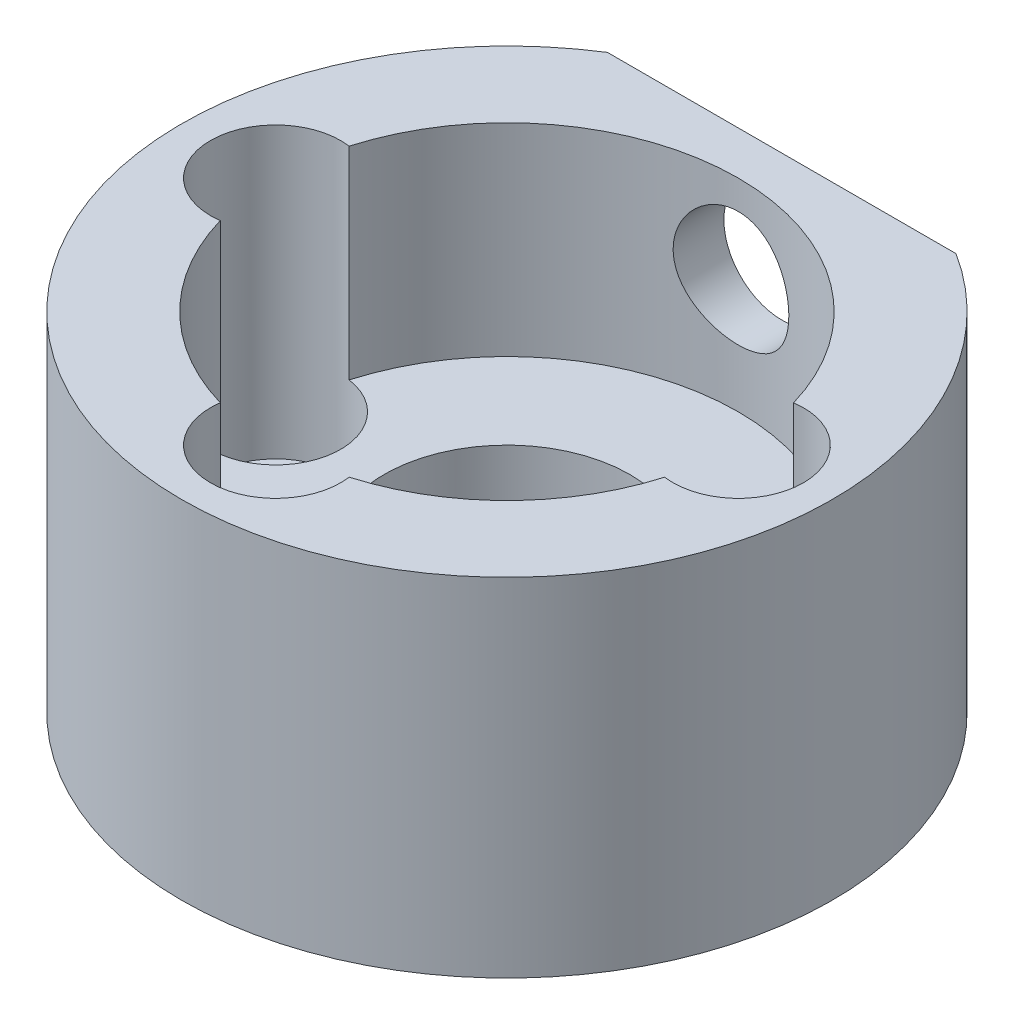
ISO-10303-21;
HEADER;
FILE_DESCRIPTION(('STEP AP214'),'2;1');
FILE_NAME('part.step','',(''),(''),'','','');
FILE_SCHEMA(('AUTOMOTIVE_DESIGN { 1 0 10303 214 1 1 1 1 }'));
ENDSEC;
DATA;
#1=APPLICATION_CONTEXT('core data for automotive mechanical design processes');
#2=APPLICATION_PROTOCOL_DEFINITION('international standard','automotive_design',2000,#1);
#3=PRODUCT_CONTEXT('',#1,'mechanical');
#4=PRODUCT('Part','Part','',(#3));
#5=PRODUCT_RELATED_PRODUCT_CATEGORY('part','',(#4));
#6=PRODUCT_DEFINITION_FORMATION('','',#4);
#7=PRODUCT_DEFINITION_CONTEXT('part definition',#1,'design');
#8=PRODUCT_DEFINITION('design','',#6,#7);
#9=PRODUCT_DEFINITION_SHAPE('','',#8);
#10=(LENGTH_UNIT() NAMED_UNIT(*) SI_UNIT(.MILLI.,.METRE.));
#11=(NAMED_UNIT(*) PLANE_ANGLE_UNIT() SI_UNIT($,.RADIAN.));
#12=(NAMED_UNIT(*) SI_UNIT($,.STERADIAN.) SOLID_ANGLE_UNIT());
#13=UNCERTAINTY_MEASURE_WITH_UNIT(LENGTH_MEASURE(1.E-05),#10,'distance_accuracy_value','');
#14=(GEOMETRIC_REPRESENTATION_CONTEXT(3) GLOBAL_UNCERTAINTY_ASSIGNED_CONTEXT((#13)) GLOBAL_UNIT_ASSIGNED_CONTEXT((#10,
#11,#12)) REPRESENTATION_CONTEXT('',''));
#15=CARTESIAN_POINT('',(0.,0.,0.));
#16=DIRECTION('',(0.,0.,1.));
#17=DIRECTION('',(1.,0.,0.));
#18=AXIS2_PLACEMENT_3D('',#15,#16,#17);
#19=CARTESIAN_POINT('',(0.,12.,0.));
#20=DIRECTION('',(0.,-1.,0.));
#21=DIRECTION('',(0.,0.,-1.));
#22=AXIS2_PLACEMENT_3D('',#19,#20,#21);
#23=CYLINDRICAL_SURFACE('',#22,11.25);
#24=CARTESIAN_POINT('',(0.,0.,0.));
#25=DIRECTION('',(0.,1.,0.));
#26=DIRECTION('',(0.,0.,1.));
#27=AXIS2_PLACEMENT_3D('',#24,#25,#26);
#28=CIRCLE('',#27,11.25);
#29=CARTESIAN_POINT('',(-6.02598539659698,0.,-9.5));
#30=VERTEX_POINT('',#29);
#31=CARTESIAN_POINT('',(6.02598539659698,0.,-9.5));
#32=VERTEX_POINT('',#31);
#33=EDGE_CURVE('E82',#30,#32,#28,.T.);
#34=ORIENTED_EDGE('',*,*,#33,.T.);
#35=DIRECTION('',(0.,-1.,0.));
#36=VECTOR('',#35,1.);
#37=CARTESIAN_POINT('',(6.02598539659698,12.,-9.5));
#38=LINE('',#37,#36);
#39=CARTESIAN_POINT('',(6.02598539659698,12.,-9.5));
#40=VERTEX_POINT('',#39);
#41=EDGE_CURVE('E77',#40,#32,#38,.T.);
#42=ORIENTED_EDGE('',*,*,#41,.F.);
#43=CARTESIAN_POINT('',(0.,12.,0.));
#44=DIRECTION('',(0.,1.,0.));
#45=DIRECTION('',(0.,0.,1.));
#46=AXIS2_PLACEMENT_3D('',#43,#44,#45);
#47=CIRCLE('',#46,11.25);
#48=CARTESIAN_POINT('',(-6.02598539659698,12.,-9.5));
#49=VERTEX_POINT('',#48);
#50=EDGE_CURVE('E81',#49,#40,#47,.T.);
#51=ORIENTED_EDGE('',*,*,#50,.F.);
#52=DIRECTION('',(0.,-1.,0.));
#53=VECTOR('',#52,1.);
#54=CARTESIAN_POINT('',(-6.02598539659698,12.,-9.5));
#55=LINE('',#54,#53);
#56=EDGE_CURVE('E74',#49,#30,#55,.T.);
#57=ORIENTED_EDGE('',*,*,#56,.T.);
#58=EDGE_LOOP('',(#34,#42,#51,#57));
#59=FACE_BOUND('',#58,.T.);
#60=ADVANCED_FACE('F35',(#59),#23,.T.);
#61=CARTESIAN_POINT('',(6.02598539659698,12.,-9.5));
#62=DIRECTION('',(0.,0.,1.));
#63=DIRECTION('',(1.,0.,0.));
#64=AXIS2_PLACEMENT_3D('',#61,#62,#63);
#65=PLANE('',#64);
#66=CARTESIAN_POINT('',(0.,9.00000000000001,-9.5));
#67=DIRECTION('',(0.,0.,-1.));
#68=DIRECTION('',(-1.,0.,0.));
#69=AXIS2_PLACEMENT_3D('',#66,#67,#68);
#70=CIRCLE('',#69,2.);
#71=CARTESIAN_POINT('',(-2.,9.00000000000001,-9.5));
#72=VERTEX_POINT('',#71);
#73=EDGE_CURVE('E107',#72,#72,#70,.T.);
#74=ORIENTED_EDGE('',*,*,#73,.F.);
#75=EDGE_LOOP('',(#74));
#76=FACE_BOUND('',#75,.T.);
#77=DIRECTION('',(-1.,0.,0.));
#78=VECTOR('',#77,1.);
#79=CARTESIAN_POINT('',(6.02598539659698,0.,-9.5));
#80=LINE('',#79,#78);
#81=EDGE_CURVE('E71',#32,#30,#80,.T.);
#82=ORIENTED_EDGE('',*,*,#81,.T.);
#83=ORIENTED_EDGE('',*,*,#56,.F.);
#84=DIRECTION('',(-1.,0.,0.));
#85=VECTOR('',#84,1.);
#86=CARTESIAN_POINT('',(6.02598539659698,12.,-9.5));
#87=LINE('',#86,#85);
#88=EDGE_CURVE('E59',#40,#49,#87,.T.);
#89=ORIENTED_EDGE('',*,*,#88,.F.);
#90=ORIENTED_EDGE('',*,*,#41,.T.);
#91=EDGE_LOOP('',(#82,#83,#89,#90));
#92=FACE_BOUND('',#91,.T.);
#93=ADVANCED_FACE('F73',(#76,#92),#65,.F.);
#94=CARTESIAN_POINT('',(0.,12.,0.));
#95=DIRECTION('',(0.,1.,0.));
#96=DIRECTION('',(0.,0.,1.));
#97=AXIS2_PLACEMENT_3D('',#94,#95,#96);
#98=PLANE('',#97);
#99=CARTESIAN_POINT('',(0.,12.,0.));
#100=DIRECTION('',(0.,1.,0.));
#101=DIRECTION('',(0.,0.,1.));
#102=AXIS2_PLACEMENT_3D('',#99,#100,#101);
#103=CIRCLE('',#102,8.);
#104=CARTESIAN_POINT('',(2.227641597062,12.,7.68359375));
#105=VERTEX_POINT('',#104);
#106=CARTESIAN_POINT('',(7.68359375,12.,2.227641597062));
#107=VERTEX_POINT('',#106);
#108=EDGE_CURVE('E212',#105,#107,#103,.T.);
#109=ORIENTED_EDGE('',*,*,#108,.F.);
#110=CARTESIAN_POINT('',(0.,12.,8.));
#111=DIRECTION('',(0.,1.,0.));
#112=DIRECTION('',(0.,0.,1.));
#113=AXIS2_PLACEMENT_3D('',#110,#111,#112);
#114=CIRCLE('',#113,2.25);
#115=CARTESIAN_POINT('',(-2.227641597062,12.,7.68359375));
#116=VERTEX_POINT('',#115);
#117=EDGE_CURVE('E241',#116,#105,#114,.T.);
#118=ORIENTED_EDGE('',*,*,#117,.F.);
#119=CARTESIAN_POINT('',(-7.68359375,12.,2.227641597062));
#120=VERTEX_POINT('',#119);
#121=EDGE_CURVE('E106',#120,#116,#103,.T.);
#122=ORIENTED_EDGE('',*,*,#121,.F.);
#123=CARTESIAN_POINT('',(-8.,12.,0.));
#124=DIRECTION('',(0.,1.,0.));
#125=DIRECTION('',(0.,0.,1.));
#126=AXIS2_PLACEMENT_3D('',#123,#124,#125);
#127=CIRCLE('',#126,2.25);
#128=CARTESIAN_POINT('',(-7.68359375,12.,-2.227641597062));
#129=VERTEX_POINT('',#128);
#130=EDGE_CURVE('E253',#129,#120,#127,.T.);
#131=ORIENTED_EDGE('',*,*,#130,.F.);
#132=CARTESIAN_POINT('',(7.68359375,12.,-2.227641597062));
#133=VERTEX_POINT('',#132);
#134=EDGE_CURVE('E218',#133,#129,#103,.T.);
#135=ORIENTED_EDGE('',*,*,#134,.F.);
#136=CARTESIAN_POINT('',(8.,12.,0.));
#137=DIRECTION('',(0.,1.,0.));
#138=DIRECTION('',(0.,0.,1.));
#139=AXIS2_PLACEMENT_3D('',#136,#137,#138);
#140=CIRCLE('',#139,2.25);
#141=EDGE_CURVE('E232',#107,#133,#140,.T.);
#142=ORIENTED_EDGE('',*,*,#141,.F.);
#143=EDGE_LOOP('',(#109,#118,#122,#131,#135,#142));
#144=FACE_BOUND('',#143,.T.);
#145=ORIENTED_EDGE('',*,*,#50,.T.);
#146=ORIENTED_EDGE('',*,*,#88,.T.);
#147=EDGE_LOOP('',(#145,#146));
#148=FACE_BOUND('',#147,.T.);
#149=ADVANCED_FACE('F134',(#144,#148),#98,.T.);
#150=CARTESIAN_POINT('',(0.,0.,0.));
#151=DIRECTION('',(0.,1.,0.));
#152=DIRECTION('',(0.,0.,1.));
#153=AXIS2_PLACEMENT_3D('',#150,#151,#152);
#154=PLANE('',#153);
#155=CARTESIAN_POINT('',(0.,0.,0.));
#156=DIRECTION('',(0.,-1.,0.));
#157=DIRECTION('',(0.,0.,-1.));
#158=AXIS2_PLACEMENT_3D('',#155,#156,#157);
#159=CIRCLE('',#158,4.25);
#160=CARTESIAN_POINT('',(0.,0.,-4.25));
#161=VERTEX_POINT('',#160);
#162=EDGE_CURVE('E323',#161,#161,#159,.T.);
#163=ORIENTED_EDGE('',*,*,#162,.F.);
#164=EDGE_LOOP('',(#163));
#165=FACE_BOUND('',#164,.T.);
#166=CARTESIAN_POINT('',(8.,0.,0.));
#167=DIRECTION('',(0.,1.,0.));
#168=DIRECTION('',(0.,0.,1.));
#169=AXIS2_PLACEMENT_3D('',#166,#167,#168);
#170=CIRCLE('',#169,1.25);
#171=CARTESIAN_POINT('',(8.,0.,1.25));
#172=VERTEX_POINT('',#171);
#173=EDGE_CURVE('E238',#172,#172,#170,.T.);
#174=ORIENTED_EDGE('',*,*,#173,.T.);
#175=EDGE_LOOP('',(#174));
#176=FACE_BOUND('',#175,.T.);
#177=CARTESIAN_POINT('',(0.,0.,8.));
#178=DIRECTION('',(0.,1.,0.));
#179=DIRECTION('',(0.,0.,1.));
#180=AXIS2_PLACEMENT_3D('',#177,#178,#179);
#181=CIRCLE('',#180,1.25);
#182=CARTESIAN_POINT('',(0.,0.,9.25));
#183=VERTEX_POINT('',#182);
#184=EDGE_CURVE('E250',#183,#183,#181,.T.);
#185=ORIENTED_EDGE('',*,*,#184,.T.);
#186=EDGE_LOOP('',(#185));
#187=FACE_BOUND('',#186,.T.);
#188=CARTESIAN_POINT('',(-8.,0.,0.));
#189=DIRECTION('',(0.,1.,0.));
#190=DIRECTION('',(0.,0.,1.));
#191=AXIS2_PLACEMENT_3D('',#188,#189,#190);
#192=CIRCLE('',#191,1.25);
#193=CARTESIAN_POINT('',(-8.,0.,1.25));
#194=VERTEX_POINT('',#193);
#195=EDGE_CURVE('E87',#194,#194,#192,.T.);
#196=ORIENTED_EDGE('',*,*,#195,.T.);
#197=EDGE_LOOP('',(#196));
#198=FACE_BOUND('',#197,.T.);
#199=ORIENTED_EDGE('',*,*,#33,.F.);
#200=ORIENTED_EDGE('',*,*,#81,.F.);
#201=EDGE_LOOP('',(#199,#200));
#202=FACE_BOUND('',#201,.T.);
#203=ADVANCED_FACE('F86',(#165,#176,#187,#198,#202),#154,.F.);
#204=CARTESIAN_POINT('',(-8.,12.,0.));
#205=DIRECTION('',(0.,1.,0.));
#206=DIRECTION('',(0.,0.,1.));
#207=AXIS2_PLACEMENT_3D('',#204,#205,#206);
#208=CYLINDRICAL_SURFACE('',#207,1.25);
#209=ORIENTED_EDGE('',*,*,#195,.F.);
#210=EDGE_LOOP('',(#209));
#211=FACE_BOUND('',#210,.T.);
#212=CARTESIAN_POINT('',(-8.,2.,0.));
#213=DIRECTION('',(0.,1.,0.));
#214=DIRECTION('',(0.,0.,1.));
#215=AXIS2_PLACEMENT_3D('',#212,#213,#214);
#216=CIRCLE('',#215,1.25);
#217=CARTESIAN_POINT('',(-8.,2.,1.25));
#218=VERTEX_POINT('',#217);
#219=EDGE_CURVE('E90',#218,#218,#216,.T.);
#220=ORIENTED_EDGE('',*,*,#219,.T.);
#221=EDGE_LOOP('',(#220));
#222=FACE_BOUND('',#221,.T.);
#223=ADVANCED_FACE('F143',(#211,#222),#208,.F.);
#224=CARTESIAN_POINT('',(-6.75,2.,0.));
#225=DIRECTION('',(0.,-1.,0.));
#226=DIRECTION('',(0.,0.,-1.));
#227=AXIS2_PLACEMENT_3D('',#224,#225,#226);
#228=PLANE('',#227);
#229=ORIENTED_EDGE('',*,*,#219,.F.);
#230=EDGE_LOOP('',(#229));
#231=FACE_BOUND('',#230,.T.);
#232=CARTESIAN_POINT('',(-8.,2.,0.));
#233=DIRECTION('',(0.,1.,0.));
#234=DIRECTION('',(0.,0.,1.));
#235=AXIS2_PLACEMENT_3D('',#232,#233,#234);
#236=CIRCLE('',#235,2.25);
#237=CARTESIAN_POINT('',(-8.,2.,2.25));
#238=VERTEX_POINT('',#237);
#239=EDGE_CURVE('E256',#238,#238,#236,.T.);
#240=ORIENTED_EDGE('',*,*,#239,.T.);
#241=EDGE_LOOP('',(#240));
#242=FACE_BOUND('',#241,.T.);
#243=ADVANCED_FACE('F148',(#231,#242),#228,.F.);
#244=CARTESIAN_POINT('',(-8.,12.,0.));
#245=DIRECTION('',(0.,1.,0.));
#246=DIRECTION('',(0.,0.,1.));
#247=AXIS2_PLACEMENT_3D('',#244,#245,#246);
#248=CYLINDRICAL_SURFACE('',#247,2.25);
#249=ORIENTED_EDGE('',*,*,#239,.F.);
#250=EDGE_LOOP('',(#249));
#251=FACE_BOUND('',#250,.T.);
#252=CARTESIAN_POINT('',(-8.,5.,0.));
#253=DIRECTION('',(0.,1.,0.));
#254=DIRECTION('',(0.,0.,1.));
#255=AXIS2_PLACEMENT_3D('',#252,#253,#254);
#256=CIRCLE('',#255,2.25);
#257=CARTESIAN_POINT('',(-7.68359375,5.,-2.227641597062));
#258=VERTEX_POINT('',#257);
#259=CARTESIAN_POINT('',(-7.68359375,5.,2.227641597062));
#260=VERTEX_POINT('',#259);
#261=EDGE_CURVE('E220',#258,#260,#256,.F.);
#262=ORIENTED_EDGE('',*,*,#261,.F.);
#263=DIRECTION('',(0.,1.,0.));
#264=VECTOR('',#263,1.);
#265=CARTESIAN_POINT('',(-7.68359375,8.5,-2.227641597062));
#266=LINE('',#265,#264);
#267=EDGE_CURVE('E207',#258,#129,#266,.T.);
#268=ORIENTED_EDGE('',*,*,#267,.T.);
#269=ORIENTED_EDGE('',*,*,#130,.T.);
#270=DIRECTION('',(0.,1.,0.));
#271=VECTOR('',#270,1.);
#272=CARTESIAN_POINT('',(-7.68359375,8.5,2.227641597062));
#273=LINE('',#272,#271);
#274=EDGE_CURVE('E228',#120,#260,#273,.F.);
#275=ORIENTED_EDGE('',*,*,#274,.T.);
#276=EDGE_LOOP('',(#262,#268,#269,#275));
#277=FACE_BOUND('',#276,.T.);
#278=ADVANCED_FACE('F152',(#251,#277),#248,.F.);
#279=CARTESIAN_POINT('',(0.,12.,8.));
#280=DIRECTION('',(0.,1.,0.));
#281=DIRECTION('',(0.,0.,1.));
#282=AXIS2_PLACEMENT_3D('',#279,#280,#281);
#283=CYLINDRICAL_SURFACE('',#282,1.25);
#284=ORIENTED_EDGE('',*,*,#184,.F.);
#285=EDGE_LOOP('',(#284));
#286=FACE_BOUND('',#285,.T.);
#287=CARTESIAN_POINT('',(0.,2.,8.));
#288=DIRECTION('',(0.,1.,0.));
#289=DIRECTION('',(0.,0.,1.));
#290=AXIS2_PLACEMENT_3D('',#287,#288,#289);
#291=CIRCLE('',#290,1.25);
#292=CARTESIAN_POINT('',(0.,2.,9.25));
#293=VERTEX_POINT('',#292);
#294=EDGE_CURVE('E247',#293,#293,#291,.T.);
#295=ORIENTED_EDGE('',*,*,#294,.T.);
#296=EDGE_LOOP('',(#295));
#297=FACE_BOUND('',#296,.T.);
#298=ADVANCED_FACE('F156',(#286,#297),#283,.F.);
#299=CARTESIAN_POINT('',(1.25,2.,8.));
#300=DIRECTION('',(0.,-1.,0.));
#301=DIRECTION('',(0.,0.,-1.));
#302=AXIS2_PLACEMENT_3D('',#299,#300,#301);
#303=PLANE('',#302);
#304=ORIENTED_EDGE('',*,*,#294,.F.);
#305=EDGE_LOOP('',(#304));
#306=FACE_BOUND('',#305,.T.);
#307=CARTESIAN_POINT('',(0.,2.,8.));
#308=DIRECTION('',(0.,1.,0.));
#309=DIRECTION('',(0.,0.,1.));
#310=AXIS2_PLACEMENT_3D('',#307,#308,#309);
#311=CIRCLE('',#310,2.25);
#312=CARTESIAN_POINT('',(0.,2.,10.25));
#313=VERTEX_POINT('',#312);
#314=EDGE_CURVE('E244',#313,#313,#311,.T.);
#315=ORIENTED_EDGE('',*,*,#314,.T.);
#316=EDGE_LOOP('',(#315));
#317=FACE_BOUND('',#316,.T.);
#318=ADVANCED_FACE('F160',(#306,#317),#303,.F.);
#319=CARTESIAN_POINT('',(0.,12.,8.));
#320=DIRECTION('',(0.,1.,0.));
#321=DIRECTION('',(0.,0.,1.));
#322=AXIS2_PLACEMENT_3D('',#319,#320,#321);
#323=CYLINDRICAL_SURFACE('',#322,2.25);
#324=ORIENTED_EDGE('',*,*,#314,.F.);
#325=EDGE_LOOP('',(#324));
#326=FACE_BOUND('',#325,.T.);
#327=CARTESIAN_POINT('',(0.,5.,8.));
#328=DIRECTION('',(0.,1.,0.));
#329=DIRECTION('',(0.,0.,1.));
#330=AXIS2_PLACEMENT_3D('',#327,#328,#329);
#331=CIRCLE('',#330,2.25);
#332=CARTESIAN_POINT('',(-2.227641597062,5.,7.68359375));
#333=VERTEX_POINT('',#332);
#334=CARTESIAN_POINT('',(2.227641597062,5.,7.68359375));
#335=VERTEX_POINT('',#334);
#336=EDGE_CURVE('E210',#333,#335,#331,.F.);
#337=ORIENTED_EDGE('',*,*,#336,.F.);
#338=DIRECTION('',(0.,1.,0.));
#339=VECTOR('',#338,1.);
#340=CARTESIAN_POINT('',(-2.227641597062,8.5,7.68359375));
#341=LINE('',#340,#339);
#342=EDGE_CURVE('E225',#333,#116,#341,.T.);
#343=ORIENTED_EDGE('',*,*,#342,.T.);
#344=ORIENTED_EDGE('',*,*,#117,.T.);
#345=DIRECTION('',(0.,1.,0.));
#346=VECTOR('',#345,1.);
#347=CARTESIAN_POINT('',(2.227641597062,8.5,7.68359375));
#348=LINE('',#347,#346);
#349=EDGE_CURVE('E222',#105,#335,#348,.F.);
#350=ORIENTED_EDGE('',*,*,#349,.T.);
#351=EDGE_LOOP('',(#337,#343,#344,#350));
#352=FACE_BOUND('',#351,.T.);
#353=ADVANCED_FACE('F164',(#326,#352),#323,.F.);
#354=CARTESIAN_POINT('',(8.,12.,0.));
#355=DIRECTION('',(0.,1.,0.));
#356=DIRECTION('',(0.,0.,1.));
#357=AXIS2_PLACEMENT_3D('',#354,#355,#356);
#358=CYLINDRICAL_SURFACE('',#357,1.25);
#359=ORIENTED_EDGE('',*,*,#173,.F.);
#360=EDGE_LOOP('',(#359));
#361=FACE_BOUND('',#360,.T.);
#362=CARTESIAN_POINT('',(8.,2.,0.));
#363=DIRECTION('',(0.,1.,0.));
#364=DIRECTION('',(0.,0.,1.));
#365=AXIS2_PLACEMENT_3D('',#362,#363,#364);
#366=CIRCLE('',#365,1.25);
#367=CARTESIAN_POINT('',(8.,2.,1.25));
#368=VERTEX_POINT('',#367);
#369=EDGE_CURVE('E235',#368,#368,#366,.T.);
#370=ORIENTED_EDGE('',*,*,#369,.T.);
#371=EDGE_LOOP('',(#370));
#372=FACE_BOUND('',#371,.T.);
#373=ADVANCED_FACE('F168',(#361,#372),#358,.F.);
#374=CARTESIAN_POINT('',(9.25,2.,0.));
#375=DIRECTION('',(0.,-1.,0.));
#376=DIRECTION('',(0.,0.,-1.));
#377=AXIS2_PLACEMENT_3D('',#374,#375,#376);
#378=PLANE('',#377);
#379=ORIENTED_EDGE('',*,*,#369,.F.);
#380=EDGE_LOOP('',(#379));
#381=FACE_BOUND('',#380,.T.);
#382=CARTESIAN_POINT('',(8.,2.,0.));
#383=DIRECTION('',(0.,1.,0.));
#384=DIRECTION('',(0.,0.,1.));
#385=AXIS2_PLACEMENT_3D('',#382,#383,#384);
#386=CIRCLE('',#385,2.25);
#387=CARTESIAN_POINT('',(8.,2.,2.25));
#388=VERTEX_POINT('',#387);
#389=EDGE_CURVE('E186',#388,#388,#386,.T.);
#390=ORIENTED_EDGE('',*,*,#389,.T.);
#391=EDGE_LOOP('',(#390));
#392=FACE_BOUND('',#391,.T.);
#393=ADVANCED_FACE('F172',(#381,#392),#378,.F.);
#394=CARTESIAN_POINT('',(8.,12.,0.));
#395=DIRECTION('',(0.,1.,0.));
#396=DIRECTION('',(0.,0.,1.));
#397=AXIS2_PLACEMENT_3D('',#394,#395,#396);
#398=CYLINDRICAL_SURFACE('',#397,2.25);
#399=ORIENTED_EDGE('',*,*,#389,.F.);
#400=EDGE_LOOP('',(#399));
#401=FACE_BOUND('',#400,.T.);
#402=CARTESIAN_POINT('',(8.,5.,0.));
#403=DIRECTION('',(0.,1.,0.));
#404=DIRECTION('',(0.,0.,1.));
#405=AXIS2_PLACEMENT_3D('',#402,#403,#404);
#406=CIRCLE('',#405,2.25);
#407=CARTESIAN_POINT('',(7.68359375,5.,2.227641597062));
#408=VERTEX_POINT('',#407);
#409=CARTESIAN_POINT('',(7.68359375,5.,-2.227641597062));
#410=VERTEX_POINT('',#409);
#411=EDGE_CURVE('E96',#408,#410,#406,.F.);
#412=ORIENTED_EDGE('',*,*,#411,.F.);
#413=DIRECTION('',(0.,1.,0.));
#414=VECTOR('',#413,1.);
#415=CARTESIAN_POINT('',(7.68359375,8.5,2.227641597062));
#416=LINE('',#415,#414);
#417=EDGE_CURVE('E11',#408,#107,#416,.T.);
#418=ORIENTED_EDGE('',*,*,#417,.T.);
#419=ORIENTED_EDGE('',*,*,#141,.T.);
#420=DIRECTION('',(0.,1.,0.));
#421=VECTOR('',#420,1.);
#422=CARTESIAN_POINT('',(7.68359375,8.5,-2.227641597062));
#423=LINE('',#422,#421);
#424=EDGE_CURVE('E43',#133,#410,#423,.F.);
#425=ORIENTED_EDGE('',*,*,#424,.T.);
#426=EDGE_LOOP('',(#412,#418,#419,#425));
#427=FACE_BOUND('',#426,.T.);
#428=ADVANCED_FACE('F175',(#401,#427),#398,.F.);
#429=CARTESIAN_POINT('',(0.,5.,0.));
#430=DIRECTION('',(0.,1.,0.));
#431=DIRECTION('',(0.,0.,1.));
#432=AXIS2_PLACEMENT_3D('',#429,#430,#431);
#433=CYLINDRICAL_SURFACE('',#432,8.);
#434=CARTESIAN_POINT('',(-2.,9.00000000000001,-7.74596669241483));
#435=CARTESIAN_POINT('',(-1.99999686287446,9.11044060074127,-7.74596880070288));
#436=CARTESIAN_POINT('',(-1.99082099639812,9.22091591894282,-7.74835444811678));
#437=CARTESIAN_POINT('',(-1.95441850037103,9.43869406253881,-7.75761489594051));
#438=CARTESIAN_POINT('',(-1.92718136539368,9.54599500357455,-7.76449230897304));
#439=CARTESIAN_POINT('',(-1.85559295970563,9.75424283054975,-7.7819097967692));
#440=CARTESIAN_POINT('',(-1.81126378228359,9.85519772430857,-7.79244514152366));
#441=CARTESIAN_POINT('',(-1.70681691300911,10.0482486820319,-7.81598553623007));
#442=CARTESIAN_POINT('',(-1.64669855084855,10.1403443696642,-7.82899069102791));
#443=CARTESIAN_POINT('',(-1.5109667418495,10.3150893162098,-7.856325730845));
#444=CARTESIAN_POINT('',(-1.43506951016324,10.39751488028,-7.87067678098427));
#445=CARTESIAN_POINT('',(-1.27054565128053,10.5486091154883,-7.89890300412235));
#446=CARTESIAN_POINT('',(-1.18191783534425,10.6172765004974,-7.91277813253111));
#447=CARTESIAN_POINT('',(-0.992916160863164,10.739820374105,-7.93872332416466));
#448=CARTESIAN_POINT('',(-0.892395660956097,10.7934771105292,-7.95076549920474));
#449=CARTESIAN_POINT('',(-0.68341054743421,10.8830477153225,-7.97144649540787));
#450=CARTESIAN_POINT('',(-0.574947108633552,10.9189642015324,-7.98008581867475));
#451=CARTESIAN_POINT('',(-0.355487007003329,10.9713182676629,-7.99283807078544));
#452=CARTESIAN_POINT('',(-0.24458617563918,10.9881357154613,-7.99703915075451));
#453=CARTESIAN_POINT('',(-0.0214630554102151,11.0030067034204,-8.00074875285838));
#454=CARTESIAN_POINT('',(0.0907590356304552,11.0010630177677,-8.00025796877363));
#455=CARTESIAN_POINT('',(0.310704494344775,10.9787401197999,-7.99470475962828));
#456=CARTESIAN_POINT('',(0.418472431202134,10.9587709399569,-7.98974401872699));
#457=CARTESIAN_POINT('',(0.629076494827373,10.9016229839612,-7.97592669219883));
#458=CARTESIAN_POINT('',(0.731912358740876,10.8644432916981,-7.96706989918753));
#459=CARTESIAN_POINT('',(0.930813407003613,10.7735979434504,-7.94630007760717));
#460=CARTESIAN_POINT('',(1.02680901953301,10.7197863642706,-7.93436015756043));
#461=CARTESIAN_POINT('',(1.20855124468098,10.597315456707,-7.90871923047719));
#462=CARTESIAN_POINT('',(1.29429607017101,10.5286535451515,-7.89501791721992));
#463=CARTESIAN_POINT('',(1.45554807016991,10.3762330064141,-7.86690971015616));
#464=CARTESIAN_POINT('',(1.5307153581504,10.2921160861218,-7.85249375620734));
#465=CARTESIAN_POINT('',(1.66595275192604,10.1123200211678,-7.82492034813365));
#466=CARTESIAN_POINT('',(1.72602215209203,10.0166403364072,-7.81176295284776));
#467=CARTESIAN_POINT('',(1.8295762580452,9.81576797268083,-7.78816397465319));
#468=CARTESIAN_POINT('',(1.87297913394098,9.71053141574945,-7.77773586980577));
#469=CARTESIAN_POINT('',(1.94137124127268,9.49393162553884,-7.76094912111966));
#470=CARTESIAN_POINT('',(1.96636441310582,9.3825697088135,-7.75458960648175));
#471=CARTESIAN_POINT('',(1.99666371093214,9.16003239878151,-7.74684284831312));
#472=CARTESIAN_POINT('',(2.0024723791357,9.0489297653363,-7.74532871274918));
#473=CARTESIAN_POINT('',(1.99561359241244,8.82734245073748,-7.74709874784831));
#474=CARTESIAN_POINT('',(1.98294783827904,8.71685771363901,-7.75038247681013));
#475=CARTESIAN_POINT('',(1.93994037115013,8.50150858803624,-7.76125665563648));
#476=CARTESIAN_POINT('',(1.9098912546254,8.39658181874333,-7.768775761875));
#477=CARTESIAN_POINT('',(1.8332944653365,8.19325483371866,-7.7872057461677));
#478=CARTESIAN_POINT('',(1.78674483817004,8.09485539275573,-7.79811702598891));
#479=CARTESIAN_POINT('',(1.67741653434925,7.90524697770613,-7.8223690967461));
#480=CARTESIAN_POINT('',(1.6143374030685,7.81421692796552,-7.83575334885313));
#481=CARTESIAN_POINT('',(1.47412058586891,7.64384930975892,-7.86333666457373));
#482=CARTESIAN_POINT('',(1.39698058961088,7.56451366667995,-7.87753586182776));
#483=CARTESIAN_POINT('',(1.22852544196945,7.41775116594324,-7.90557922425285));
#484=CARTESIAN_POINT('',(1.13690390506319,7.35067194996096,-7.91940561649468));
#485=CARTESIAN_POINT('',(0.943405365389353,7.23285130643901,-7.94477773290987));
#486=CARTESIAN_POINT('',(0.841528897915183,7.18210902671344,-7.95632357603169));
#487=CARTESIAN_POINT('',(0.631116403462182,7.09884317237766,-7.9757609259065));
#488=CARTESIAN_POINT('',(0.522634762055765,7.06618857249675,-7.98367864017925));
#489=CARTESIAN_POINT('',(0.301499520637615,7.01963173231327,-7.99508234716634));
#490=CARTESIAN_POINT('',(0.188846730082482,7.00572587300877,-7.99856919514738));
#491=CARTESIAN_POINT('',(-0.0341670528866446,6.99726482084893,-8.00068338817612));
#492=CARTESIAN_POINT('',(-0.144507653932041,7.00219658180919,-7.99943957759977));
#493=CARTESIAN_POINT('',(-0.3627349928295,7.0300956545887,-7.99251792914887));
#494=CARTESIAN_POINT('',(-0.470621803561855,7.05306243002634,-7.98684022314338));
#495=CARTESIAN_POINT('',(-0.680342071289547,7.11610443954173,-7.97170865707778));
#496=CARTESIAN_POINT('',(-0.782204989161725,7.15608690662876,-7.96227529004785));
#497=CARTESIAN_POINT('',(-0.977834106083248,7.25194115803915,-7.94062577827316));
#498=CARTESIAN_POINT('',(-1.07159928253127,7.30781494534097,-7.92840928277515));
#499=CARTESIAN_POINT('',(-1.25080385684661,7.43543046799227,-7.90214499360574));
#500=CARTESIAN_POINT('',(-1.33598997659667,7.50752028580766,-7.88806033883329));
#501=CARTESIAN_POINT('',(-1.49323004054701,7.6648457039547,-7.85981298114379));
#502=CARTESIAN_POINT('',(-1.56528065015318,7.75008463222233,-7.84565025934604));
#503=CARTESIAN_POINT('',(-1.69552405294366,7.93320282837893,-7.81854951691005));
#504=CARTESIAN_POINT('',(-1.75343323883276,8.03128824673051,-7.80563927346578));
#505=CARTESIAN_POINT('',(-1.85185379317094,8.23611097974964,-7.78287910989656));
#506=CARTESIAN_POINT('',(-1.8923778195043,8.3428419321877,-7.77302696466427));
#507=CARTESIAN_POINT('',(-1.948845057142,8.54115402367032,-7.75903817501475));
#508=CARTESIAN_POINT('',(-1.96798634119376,8.63178632877228,-7.75417326006998));
#509=CARTESIAN_POINT('',(-1.99356458514354,8.81493773799538,-7.7476367716524));
#510=CARTESIAN_POINT('',(-2.0000026287435,8.90745668048881,-7.74596492578215));
#511=CARTESIAN_POINT('',(-2.,9.00000000000001,-7.74596669241483));
#512=B_SPLINE_CURVE_WITH_KNOTS('',3,(#434,#435,#436,#437,#438,#439,#440,#441,#442,#443,#444,
#445,#446,#447,#448,#449,#450,#451,#452,#453,#454,#455,#456,#457,#458,#459,#460,#461,#462,#463,
#464,#465,#466,#467,#468,#469,#470,#471,#472,#473,#474,#475,#476,#477,#478,#479,#480,#481,#482,
#483,#484,#485,#486,#487,#488,#489,#490,#491,#492,#493,#494,#495,#496,#497,#498,#499,#500,#501,
#502,#503,#504,#505,#506,#507,#508,#509,#510,#511),.UNSPECIFIED.,.T.,.F.,(4,2,2,2,2,2,2,2,2,2,2,
2,2,2,2,2,2,2,2,2,2,2,2,2,2,2,2,2,2,2,2,2,2,2,2,2,2,2,4),(0.,0.33098195338891,0.662156593142932,
0.992904581732815,1.32366661404383,1.66099163354381,1.99834817183893,2.34041197118336,
2.68242527877674,3.01751000796277,3.35254518932816,3.68014610151158,4.00776445379829,
4.33834299403556,4.66897908375131,5.00856373257529,5.34816424959842,5.68941145606722,
6.03058560103638,6.36274859809374,6.69488101747042,7.02157924007366,7.34831617137134,
7.68146276687326,8.01466415108036,8.35620264772255,8.69772332575643,9.03673658245544,
9.37568439127231,9.70546756901965,10.0352409390158,10.3632390124777,10.6912784459046,
11.0271767726566,11.3631602525241,11.7054118182895,12.0474137709606,12.3247826174462,
12.6021278008238),.UNSPECIFIED.);
#513=CARTESIAN_POINT('',(-2.,9.00000000000001,-7.74596669241483));
#514=VERTEX_POINT('',#513);
#515=EDGE_CURVE('E99',#514,#514,#512,.T.);
#516=ORIENTED_EDGE('',*,*,#515,.T.);
#517=EDGE_LOOP('',(#516));
#518=FACE_BOUND('',#517,.T.);
#519=CARTESIAN_POINT('',(0.,5.,0.));
#520=DIRECTION('',(0.,1.,0.));
#521=DIRECTION('',(0.,0.,1.));
#522=AXIS2_PLACEMENT_3D('',#519,#520,#521);
#523=CIRCLE('',#522,8.);
#524=EDGE_CURVE('E197',#410,#258,#523,.T.);
#525=ORIENTED_EDGE('',*,*,#524,.F.);
#526=ORIENTED_EDGE('',*,*,#424,.F.);
#527=ORIENTED_EDGE('',*,*,#134,.T.);
#528=ORIENTED_EDGE('',*,*,#267,.F.);
#529=EDGE_LOOP('',(#525,#526,#527,#528));
#530=FACE_BOUND('',#529,.T.);
#531=ADVANCED_FACE('F108',(#518,#530),#433,.F.);
#532=ORIENTED_EDGE('',*,*,#121,.T.);
#533=ORIENTED_EDGE('',*,*,#342,.F.);
#534=EDGE_CURVE('E208',#260,#333,#523,.T.);
#535=ORIENTED_EDGE('',*,*,#534,.F.);
#536=ORIENTED_EDGE('',*,*,#274,.F.);
#537=EDGE_LOOP('',(#532,#533,#535,#536));
#538=FACE_BOUND('',#537,.T.);
#539=ADVANCED_FACE('F127',(#538),#433,.F.);
#540=ORIENTED_EDGE('',*,*,#108,.T.);
#541=ORIENTED_EDGE('',*,*,#417,.F.);
#542=EDGE_CURVE('E51',#335,#408,#523,.T.);
#543=ORIENTED_EDGE('',*,*,#542,.F.);
#544=ORIENTED_EDGE('',*,*,#349,.F.);
#545=EDGE_LOOP('',(#540,#541,#543,#544));
#546=FACE_BOUND('',#545,.T.);
#547=ADVANCED_FACE('F120',(#546),#433,.F.);
#548=CARTESIAN_POINT('',(0.,5.,0.));
#549=DIRECTION('',(0.,1.,0.));
#550=DIRECTION('',(0.,0.,1.));
#551=AXIS2_PLACEMENT_3D('',#548,#549,#550);
#552=PLANE('',#551);
#553=CARTESIAN_POINT('',(0.,5.,0.));
#554=DIRECTION('',(0.,1.,0.));
#555=DIRECTION('',(0.,0.,1.));
#556=AXIS2_PLACEMENT_3D('',#553,#554,#555);
#557=CIRCLE('',#556,4.25);
#558=CARTESIAN_POINT('',(0.,5.,4.25));
#559=VERTEX_POINT('',#558);
#560=EDGE_CURVE('E38',#559,#559,#557,.T.);
#561=ORIENTED_EDGE('',*,*,#560,.F.);
#562=EDGE_LOOP('',(#561));
#563=FACE_BOUND('',#562,.T.);
#564=ORIENTED_EDGE('',*,*,#261,.T.);
#565=ORIENTED_EDGE('',*,*,#534,.T.);
#566=ORIENTED_EDGE('',*,*,#336,.T.);
#567=ORIENTED_EDGE('',*,*,#542,.T.);
#568=ORIENTED_EDGE('',*,*,#411,.T.);
#569=ORIENTED_EDGE('',*,*,#524,.T.);
#570=EDGE_LOOP('',(#564,#565,#566,#567,#568,#569));
#571=FACE_BOUND('',#570,.T.);
#572=ADVANCED_FACE('F117',(#563,#571),#552,.T.);
#573=CARTESIAN_POINT('',(0.,9.00000000000001,0.5));
#574=DIRECTION('',(0.,0.,-1.));
#575=DIRECTION('',(-1.,0.,0.));
#576=AXIS2_PLACEMENT_3D('',#573,#574,#575);
#577=CYLINDRICAL_SURFACE('',#576,2.);
#578=ORIENTED_EDGE('',*,*,#73,.T.);
#579=EDGE_LOOP('',(#578));
#580=FACE_BOUND('',#579,.T.);
#581=ORIENTED_EDGE('',*,*,#515,.F.);
#582=EDGE_LOOP('',(#581));
#583=FACE_BOUND('',#582,.T.);
#584=ADVANCED_FACE('F112',(#580,#583),#577,.F.);
#585=CARTESIAN_POINT('',(0.,12.,0.));
#586=DIRECTION('',(0.,-1.,0.));
#587=DIRECTION('',(0.,0.,-1.));
#588=AXIS2_PLACEMENT_3D('',#585,#586,#587);
#589=CYLINDRICAL_SURFACE('',#588,4.25);
#590=ORIENTED_EDGE('',*,*,#560,.T.);
#591=EDGE_LOOP('',(#590));
#592=FACE_BOUND('',#591,.T.);
#593=ORIENTED_EDGE('',*,*,#162,.T.);
#594=EDGE_LOOP('',(#593));
#595=FACE_BOUND('',#594,.T.);
#596=ADVANCED_FACE('F116',(#592,#595),#589,.F.);
#597=CLOSED_SHELL('',(#60,#93,#149,#203,#223,#243,#278,#298,#318,#353,#373,#393,#428,#531,#539,
#547,#572,#584,#596));
#598=MANIFOLD_SOLID_BREP('B2',#597);
#599=ADVANCED_BREP_SHAPE_REPRESENTATION('',(#18,#598),#14);
#600=SHAPE_DEFINITION_REPRESENTATION(#9,#599);
ENDSEC;
END-ISO-10303-21;
